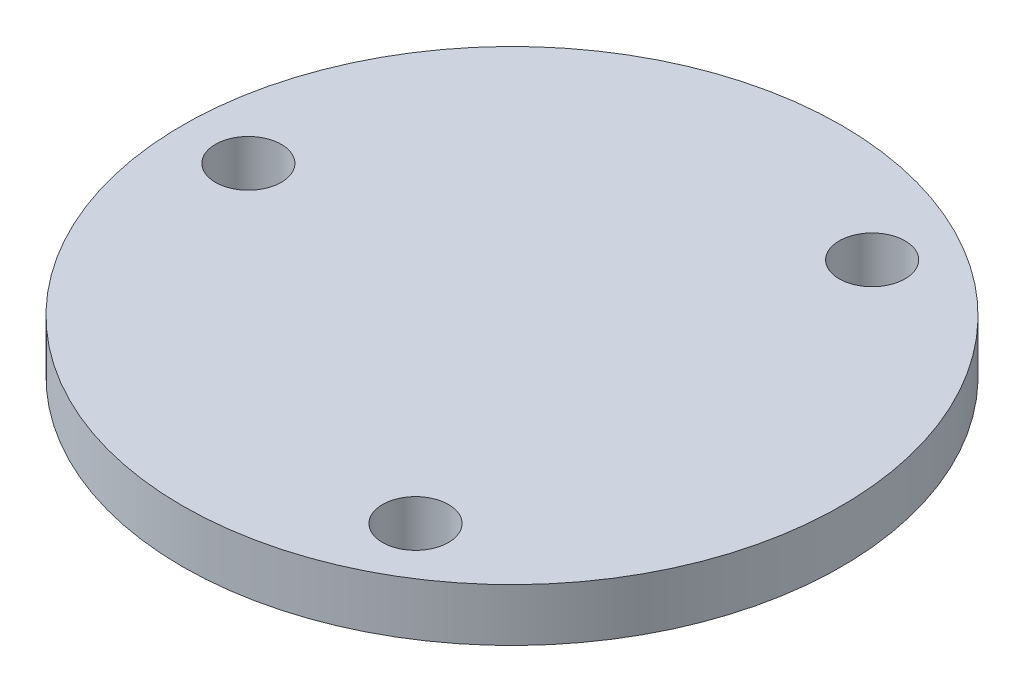
ISO-10303-21;
HEADER;
FILE_DESCRIPTION(('STEP AP214'),'2;1');
FILE_NAME('part.step','',(''),(''),'','','');
FILE_SCHEMA(('AUTOMOTIVE_DESIGN { 1 0 10303 214 1 1 1 1 }'));
ENDSEC;
DATA;
#1=APPLICATION_CONTEXT('core data for automotive mechanical design processes');
#2=APPLICATION_PROTOCOL_DEFINITION('international standard','automotive_design',2000,#1);
#3=PRODUCT_CONTEXT('',#1,'mechanical');
#4=PRODUCT('Part','Part','',(#3));
#5=PRODUCT_RELATED_PRODUCT_CATEGORY('part','',(#4));
#6=PRODUCT_DEFINITION_FORMATION('','',#4);
#7=PRODUCT_DEFINITION_CONTEXT('part definition',#1,'design');
#8=PRODUCT_DEFINITION('design','',#6,#7);
#9=PRODUCT_DEFINITION_SHAPE('','',#8);
#10=(LENGTH_UNIT() NAMED_UNIT(*) SI_UNIT(.MILLI.,.METRE.));
#11=(NAMED_UNIT(*) PLANE_ANGLE_UNIT() SI_UNIT($,.RADIAN.));
#12=(NAMED_UNIT(*) SI_UNIT($,.STERADIAN.) SOLID_ANGLE_UNIT());
#13=UNCERTAINTY_MEASURE_WITH_UNIT(LENGTH_MEASURE(1.E-05),#10,'distance_accuracy_value','');
#14=(GEOMETRIC_REPRESENTATION_CONTEXT(3) GLOBAL_UNCERTAINTY_ASSIGNED_CONTEXT((#13)) GLOBAL_UNIT_ASSIGNED_CONTEXT((#10,
#11,#12)) REPRESENTATION_CONTEXT('',''));
#15=CARTESIAN_POINT('',(0.,0.,0.));
#16=DIRECTION('',(0.,0.,1.));
#17=DIRECTION('',(1.,0.,0.));
#18=AXIS2_PLACEMENT_3D('',#15,#16,#17);
#19=CARTESIAN_POINT('',(0.,1.6,0.));
#20=DIRECTION('',(0.,1.,0.));
#21=DIRECTION('',(0.,0.,1.));
#22=AXIS2_PLACEMENT_3D('',#19,#20,#21);
#23=PLANE('',#22);
#24=CARTESIAN_POINT('',(3.99999999999998,1.6,-6.92820323027552));
#25=DIRECTION('',(0.,1.,0.));
#26=DIRECTION('',(0.,0.,1.));
#27=AXIS2_PLACEMENT_3D('',#24,#25,#26);
#28=CIRCLE('',#27,0.999999999999999);
#29=CARTESIAN_POINT('',(3.99999999999998,1.6,-5.92820323027552));
#30=VERTEX_POINT('',#29);
#31=EDGE_CURVE('E56',#30,#30,#28,.T.);
#32=ORIENTED_EDGE('',*,*,#31,.F.);
#33=EDGE_LOOP('',(#32));
#34=FACE_BOUND('',#33,.T.);
#35=CARTESIAN_POINT('',(0.,1.6,0.));
#36=DIRECTION('',(0.,1.,0.));
#37=DIRECTION('',(0.,0.,1.));
#38=AXIS2_PLACEMENT_3D('',#35,#36,#37);
#39=CIRCLE('',#38,10.);
#40=CARTESIAN_POINT('',(0.,1.6,10.));
#41=VERTEX_POINT('',#40);
#42=EDGE_CURVE('E10',#41,#41,#39,.T.);
#43=ORIENTED_EDGE('',*,*,#42,.T.);
#44=EDGE_LOOP('',(#43));
#45=FACE_BOUND('',#44,.T.);
#46=CARTESIAN_POINT('',(-8.,1.6,0.));
#47=DIRECTION('',(0.,1.,0.));
#48=DIRECTION('',(0.,0.,1.));
#49=AXIS2_PLACEMENT_3D('',#46,#47,#48);
#50=CIRCLE('',#49,1.);
#51=CARTESIAN_POINT('',(-8.,1.6,1.));
#52=VERTEX_POINT('',#51);
#53=EDGE_CURVE('E50',#52,#52,#50,.T.);
#54=ORIENTED_EDGE('',*,*,#53,.F.);
#55=EDGE_LOOP('',(#54));
#56=FACE_BOUND('',#55,.T.);
#57=CARTESIAN_POINT('',(3.99999999999999,1.6,6.92820323027552));
#58=DIRECTION('',(0.,1.,0.));
#59=DIRECTION('',(0.,0.,1.));
#60=AXIS2_PLACEMENT_3D('',#57,#58,#59);
#61=CIRCLE('',#60,1.);
#62=CARTESIAN_POINT('',(3.99999999999999,1.6,7.92820323027552));
#63=VERTEX_POINT('',#62);
#64=EDGE_CURVE('E64',#63,#63,#61,.T.);
#65=ORIENTED_EDGE('',*,*,#64,.F.);
#66=EDGE_LOOP('',(#65));
#67=FACE_BOUND('',#66,.T.);
#68=ADVANCED_FACE('F37',(#34,#45,#56,#67),#23,.T.);
#69=CARTESIAN_POINT('',(0.,0.,0.));
#70=DIRECTION('',(0.,1.,0.));
#71=DIRECTION('',(0.,0.,1.));
#72=AXIS2_PLACEMENT_3D('',#69,#70,#71);
#73=PLANE('',#72);
#74=CARTESIAN_POINT('',(0.,0.,0.));
#75=DIRECTION('',(0.,1.,0.));
#76=DIRECTION('',(0.,0.,1.));
#77=AXIS2_PLACEMENT_3D('',#74,#75,#76);
#78=CIRCLE('',#77,10.);
#79=CARTESIAN_POINT('',(0.,0.,10.));
#80=VERTEX_POINT('',#79);
#81=EDGE_CURVE('E41',#80,#80,#78,.T.);
#82=ORIENTED_EDGE('',*,*,#81,.F.);
#83=EDGE_LOOP('',(#82));
#84=FACE_BOUND('',#83,.T.);
#85=CARTESIAN_POINT('',(-8.,0.,0.));
#86=DIRECTION('',(0.,1.,0.));
#87=DIRECTION('',(0.,0.,1.));
#88=AXIS2_PLACEMENT_3D('',#85,#86,#87);
#89=CIRCLE('',#88,1.);
#90=CARTESIAN_POINT('',(-8.,0.,1.));
#91=VERTEX_POINT('',#90);
#92=EDGE_CURVE('E52',#91,#91,#89,.T.);
#93=ORIENTED_EDGE('',*,*,#92,.T.);
#94=EDGE_LOOP('',(#93));
#95=FACE_BOUND('',#94,.T.);
#96=CARTESIAN_POINT('',(3.99999999999998,0.,-6.92820323027552));
#97=DIRECTION('',(0.,1.,0.));
#98=DIRECTION('',(0.,0.,1.));
#99=AXIS2_PLACEMENT_3D('',#96,#97,#98);
#100=CIRCLE('',#99,0.999999999999999);
#101=CARTESIAN_POINT('',(3.99999999999998,0.,-5.92820323027552));
#102=VERTEX_POINT('',#101);
#103=EDGE_CURVE('E60',#102,#102,#100,.T.);
#104=ORIENTED_EDGE('',*,*,#103,.T.);
#105=EDGE_LOOP('',(#104));
#106=FACE_BOUND('',#105,.T.);
#107=CARTESIAN_POINT('',(3.99999999999999,0.,6.92820323027552));
#108=DIRECTION('',(0.,1.,0.));
#109=DIRECTION('',(0.,0.,1.));
#110=AXIS2_PLACEMENT_3D('',#107,#108,#109);
#111=CIRCLE('',#110,1.);
#112=CARTESIAN_POINT('',(3.99999999999999,0.,7.92820323027552));
#113=VERTEX_POINT('',#112);
#114=EDGE_CURVE('E68',#113,#113,#111,.T.);
#115=ORIENTED_EDGE('',*,*,#114,.T.);
#116=EDGE_LOOP('',(#115));
#117=FACE_BOUND('',#116,.T.);
#118=ADVANCED_FACE('F80',(#84,#95,#106,#117),#73,.F.);
#119=CARTESIAN_POINT('',(0.,1.6,0.));
#120=DIRECTION('',(0.,-1.,0.));
#121=DIRECTION('',(0.,0.,-1.));
#122=AXIS2_PLACEMENT_3D('',#119,#120,#121);
#123=CYLINDRICAL_SURFACE('',#122,10.);
#124=ORIENTED_EDGE('',*,*,#42,.F.);
#125=EDGE_LOOP('',(#124));
#126=FACE_BOUND('',#125,.T.);
#127=ORIENTED_EDGE('',*,*,#81,.T.);
#128=EDGE_LOOP('',(#127));
#129=FACE_BOUND('',#128,.T.);
#130=ADVANCED_FACE('F39',(#126,#129),#123,.T.);
#131=CARTESIAN_POINT('',(-8.,1.6,0.));
#132=DIRECTION('',(0.,-1.,0.));
#133=DIRECTION('',(0.,0.,-1.));
#134=AXIS2_PLACEMENT_3D('',#131,#132,#133);
#135=CYLINDRICAL_SURFACE('',#134,1.);
#136=ORIENTED_EDGE('',*,*,#53,.T.);
#137=EDGE_LOOP('',(#136));
#138=FACE_BOUND('',#137,.T.);
#139=ORIENTED_EDGE('',*,*,#92,.F.);
#140=EDGE_LOOP('',(#139));
#141=FACE_BOUND('',#140,.T.);
#142=ADVANCED_FACE('F89',(#138,#141),#135,.F.);
#143=CARTESIAN_POINT('',(3.99999999999998,1.6,-6.92820323027552));
#144=DIRECTION('',(0.,-1.,0.));
#145=DIRECTION('',(0.,0.,-1.));
#146=AXIS2_PLACEMENT_3D('',#143,#144,#145);
#147=CYLINDRICAL_SURFACE('',#146,0.999999999999999);
#148=ORIENTED_EDGE('',*,*,#31,.T.);
#149=EDGE_LOOP('',(#148));
#150=FACE_BOUND('',#149,.T.);
#151=ORIENTED_EDGE('',*,*,#103,.F.);
#152=EDGE_LOOP('',(#151));
#153=FACE_BOUND('',#152,.T.);
#154=ADVANCED_FACE('F92',(#150,#153),#147,.F.);
#155=CARTESIAN_POINT('',(3.99999999999999,1.6,6.92820323027552));
#156=DIRECTION('',(0.,-1.,0.));
#157=DIRECTION('',(0.,0.,-1.));
#158=AXIS2_PLACEMENT_3D('',#155,#156,#157);
#159=CYLINDRICAL_SURFACE('',#158,1.);
#160=ORIENTED_EDGE('',*,*,#64,.T.);
#161=EDGE_LOOP('',(#160));
#162=FACE_BOUND('',#161,.T.);
#163=ORIENTED_EDGE('',*,*,#114,.F.);
#164=EDGE_LOOP('',(#163));
#165=FACE_BOUND('',#164,.T.);
#166=ADVANCED_FACE('F76',(#162,#165),#159,.F.);
#167=CLOSED_SHELL('',(#68,#118,#130,#142,#154,#166));
#168=MANIFOLD_SOLID_BREP('B2',#167);
#169=ADVANCED_BREP_SHAPE_REPRESENTATION('',(#18,#168),#14);
#170=SHAPE_DEFINITION_REPRESENTATION(#9,#169);
ENDSEC;
END-ISO-10303-21;
